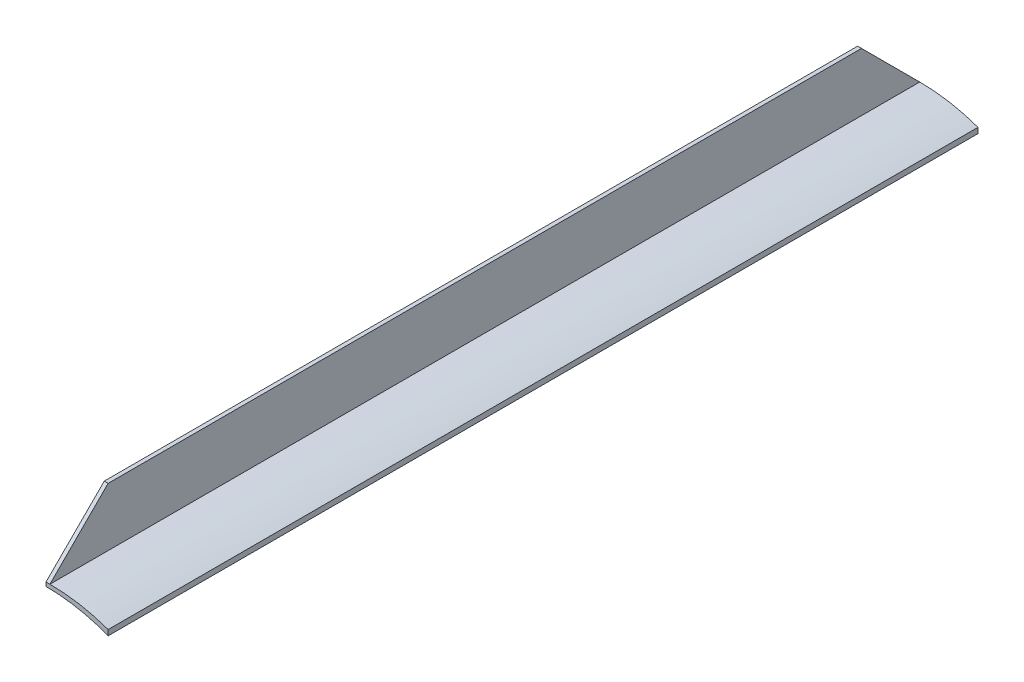
ISO-10303-21;
HEADER;
FILE_DESCRIPTION(('STEP AP214'),'2;1');
FILE_NAME('part.step','',(''),(''),'','','');
FILE_SCHEMA(('AUTOMOTIVE_DESIGN { 1 0 10303 214 1 1 1 1 }'));
ENDSEC;
DATA;
#1=APPLICATION_CONTEXT('core data for automotive mechanical design processes');
#2=APPLICATION_PROTOCOL_DEFINITION('international standard','automotive_design',2000,#1);
#3=PRODUCT_CONTEXT('',#1,'mechanical');
#4=PRODUCT('Part','Part','',(#3));
#5=PRODUCT_RELATED_PRODUCT_CATEGORY('part','',(#4));
#6=PRODUCT_DEFINITION_FORMATION('','',#4);
#7=PRODUCT_DEFINITION_CONTEXT('part definition',#1,'design');
#8=PRODUCT_DEFINITION('design','',#6,#7);
#9=PRODUCT_DEFINITION_SHAPE('','',#8);
#10=(LENGTH_UNIT() NAMED_UNIT(*) SI_UNIT(.MILLI.,.METRE.));
#11=(NAMED_UNIT(*) PLANE_ANGLE_UNIT() SI_UNIT($,.RADIAN.));
#12=(NAMED_UNIT(*) SI_UNIT($,.STERADIAN.) SOLID_ANGLE_UNIT());
#13=UNCERTAINTY_MEASURE_WITH_UNIT(LENGTH_MEASURE(1.E-05),#10,'distance_accuracy_value','');
#14=(GEOMETRIC_REPRESENTATION_CONTEXT(3) GLOBAL_UNCERTAINTY_ASSIGNED_CONTEXT((#13)) GLOBAL_UNIT_ASSIGNED_CONTEXT((#10,
#11,#12)) REPRESENTATION_CONTEXT('',''));
#15=CARTESIAN_POINT('',(0.,0.,0.));
#16=DIRECTION('',(0.,0.,1.));
#17=DIRECTION('',(1.,0.,0.));
#18=AXIS2_PLACEMENT_3D('',#15,#16,#17);
#19=CARTESIAN_POINT('',(1.5875,25.4,177.8));
#20=DIRECTION('',(-1.,0.,0.));
#21=DIRECTION('',(0.,-1.,0.));
#22=AXIS2_PLACEMENT_3D('',#19,#20,#21);
#23=PLANE('',#22);
#24=DIRECTION('',(0.,-0.707106781186548,-0.707106781186547));
#25=VECTOR('',#24,1.);
#26=CARTESIAN_POINT('',(1.5875,191.29375,11.9062499999998));
#27=LINE('',#26,#25);
#28=CARTESIAN_POINT('',(1.58750000000002,25.4,-153.9875));
#29=VERTEX_POINT('',#28);
#30=CARTESIAN_POINT('',(1.5875,1.5875,-177.8));
#31=VERTEX_POINT('',#30);
#32=EDGE_CURVE('E106',#29,#31,#27,.T.);
#33=ORIENTED_EDGE('',*,*,#32,.F.);
#34=DIRECTION('',(0.,0.,-1.));
#35=VECTOR('',#34,1.);
#36=CARTESIAN_POINT('',(1.5875,25.4,177.8));
#37=LINE('',#36,#35);
#38=CARTESIAN_POINT('',(1.58750000000002,25.4,153.9875));
#39=VERTEX_POINT('',#38);
#40=EDGE_CURVE('E131',#39,#29,#37,.T.);
#41=ORIENTED_EDGE('',*,*,#40,.F.);
#42=DIRECTION('',(0.,-0.707106781186548,0.707106781186547));
#43=VECTOR('',#42,1.);
#44=CARTESIAN_POINT('',(1.5875,13.49375,165.89375));
#45=LINE('',#44,#43);
#46=CARTESIAN_POINT('',(1.58750000000002,1.5875,177.8));
#47=VERTEX_POINT('',#46);
#48=EDGE_CURVE('E152',#39,#47,#45,.T.);
#49=ORIENTED_EDGE('',*,*,#48,.T.);
#50=DIRECTION('',(0.,0.,-1.));
#51=VECTOR('',#50,1.);
#52=CARTESIAN_POINT('',(1.5875,1.5875,177.8));
#53=LINE('',#52,#51);
#54=EDGE_CURVE('E134',#47,#31,#53,.T.);
#55=ORIENTED_EDGE('',*,*,#54,.T.);
#56=EDGE_LOOP('',(#33,#41,#49,#55));
#57=FACE_BOUND('',#56,.T.);
#58=ADVANCED_FACE('F35',(#57),#23,.F.);
#59=CARTESIAN_POINT('',(0.,25.4,177.8));
#60=DIRECTION('',(0.,-1.,0.));
#61=DIRECTION('',(0.,0.,-1.));
#62=AXIS2_PLACEMENT_3D('',#59,#60,#61);
#63=PLANE('',#62);
#64=DIRECTION('',(-1.,0.,0.));
#65=VECTOR('',#64,1.);
#66=CARTESIAN_POINT('',(387.35,25.4,-153.9875));
#67=LINE('',#66,#65);
#68=CARTESIAN_POINT('',(0.,25.4,-153.9875));
#69=VERTEX_POINT('',#68);
#70=EDGE_CURVE('E114',#29,#69,#67,.T.);
#71=ORIENTED_EDGE('',*,*,#70,.T.);
#72=DIRECTION('',(0.,0.,-1.));
#73=VECTOR('',#72,1.);
#74=CARTESIAN_POINT('',(0.,25.4,177.8));
#75=LINE('',#74,#73);
#76=CARTESIAN_POINT('',(0.,25.4,153.9875));
#77=VERTEX_POINT('',#76);
#78=EDGE_CURVE('E113',#77,#69,#75,.T.);
#79=ORIENTED_EDGE('',*,*,#78,.F.);
#80=DIRECTION('',(-1.,0.,0.));
#81=VECTOR('',#80,1.);
#82=CARTESIAN_POINT('',(387.35,25.4,153.9875));
#83=LINE('',#82,#81);
#84=EDGE_CURVE('E160',#39,#77,#83,.T.);
#85=ORIENTED_EDGE('',*,*,#84,.F.);
#86=ORIENTED_EDGE('',*,*,#40,.T.);
#87=EDGE_LOOP('',(#71,#79,#85,#86));
#88=FACE_BOUND('',#87,.T.);
#89=ADVANCED_FACE('F172',(#88),#63,.F.);
#90=CARTESIAN_POINT('',(0.,0.,177.8));
#91=DIRECTION('',(1.,0.,0.));
#92=DIRECTION('',(0.,0.,-1.));
#93=AXIS2_PLACEMENT_3D('',#90,#91,#92);
#94=PLANE('',#93);
#95=DIRECTION('',(0.,-0.707106781186548,-0.707106781186547));
#96=VECTOR('',#95,1.);
#97=CARTESIAN_POINT('',(0.,25.4,-153.9875));
#98=LINE('',#97,#96);
#99=CARTESIAN_POINT('',(0.,1.5875,-177.8));
#100=VERTEX_POINT('',#99);
#101=EDGE_CURVE('E103',#69,#100,#98,.T.);
#102=ORIENTED_EDGE('',*,*,#101,.T.);
#103=DIRECTION('',(0.,-1.,0.));
#104=VECTOR('',#103,1.);
#105=CARTESIAN_POINT('',(0.,0.,-177.8));
#106=LINE('',#105,#104);
#107=CARTESIAN_POINT('',(0.,0.,-177.8));
#108=VERTEX_POINT('',#107);
#109=EDGE_CURVE('E79',#100,#108,#106,.T.);
#110=ORIENTED_EDGE('',*,*,#109,.T.);
#111=DIRECTION('',(0.,0.,-1.));
#112=VECTOR('',#111,1.);
#113=CARTESIAN_POINT('',(0.,0.,177.8));
#114=LINE('',#113,#112);
#115=CARTESIAN_POINT('',(0.,0.,177.8));
#116=VERTEX_POINT('',#115);
#117=EDGE_CURVE('E128',#116,#108,#114,.T.);
#118=ORIENTED_EDGE('',*,*,#117,.F.);
#119=DIRECTION('',(0.,-1.,0.));
#120=VECTOR('',#119,1.);
#121=CARTESIAN_POINT('',(0.,0.,177.8));
#122=LINE('',#121,#120);
#123=CARTESIAN_POINT('',(0.,1.58750000000001,177.8));
#124=VERTEX_POINT('',#123);
#125=EDGE_CURVE('E58',#124,#116,#122,.T.);
#126=ORIENTED_EDGE('',*,*,#125,.F.);
#127=DIRECTION('',(0.,-0.707106781186548,0.707106781186547));
#128=VECTOR('',#127,1.);
#129=CARTESIAN_POINT('',(0.,25.4,153.9875));
#130=LINE('',#129,#128);
#131=EDGE_CURVE('E50',#77,#124,#130,.T.);
#132=ORIENTED_EDGE('',*,*,#131,.F.);
#133=ORIENTED_EDGE('',*,*,#78,.T.);
#134=EDGE_LOOP('',(#102,#110,#118,#126,#132,#133));
#135=FACE_BOUND('',#134,.T.);
#136=ADVANCED_FACE('F111',(#135),#94,.F.);
#137=CARTESIAN_POINT('',(0.,-69.85,-177.8));
#138=DIRECTION('',(0.,0.,-1.));
#139=DIRECTION('',(-1.,0.,0.));
#140=AXIS2_PLACEMENT_3D('',#137,#138,#139);
#141=PLANE('',#140);
#142=ORIENTED_EDGE('',*,*,#109,.F.);
#143=DIRECTION('',(1.,0.,0.));
#144=VECTOR('',#143,1.);
#145=CARTESIAN_POINT('',(0.,1.58750000000001,-177.8));
#146=LINE('',#145,#144);
#147=EDGE_CURVE('E11',#100,#31,#146,.T.);
#148=ORIENTED_EDGE('',*,*,#147,.T.);
#149=CARTESIAN_POINT('',(1.5875,-69.05625,-177.8));
#150=DIRECTION('',(0.,0.,1.));
#151=DIRECTION('',(-1.,0.,0.));
#152=AXIS2_PLACEMENT_3D('',#149,#150,#151);
#153=CIRCLE('',#152,70.64375);
#154=CARTESIAN_POINT('',(25.4,-2.54682015871735,-177.8));
#155=VERTEX_POINT('',#154);
#156=EDGE_CURVE('E121',#155,#31,#153,.T.);
#157=ORIENTED_EDGE('',*,*,#156,.F.);
#158=DIRECTION('',(0.,1.,0.));
#159=VECTOR('',#158,1.);
#160=CARTESIAN_POINT('',(25.4,-2.54682015871734,-177.8));
#161=LINE('',#160,#159);
#162=CARTESIAN_POINT('',(25.4,-4.78186263615656,-177.8));
#163=VERTEX_POINT('',#162);
#164=EDGE_CURVE('E124',#163,#155,#161,.T.);
#165=ORIENTED_EDGE('',*,*,#164,.F.);
#166=CARTESIAN_POINT('',(0.,-69.85,-177.8));
#167=DIRECTION('',(0.,0.,-1.));
#168=DIRECTION('',(-1.,0.,0.));
#169=AXIS2_PLACEMENT_3D('',#166,#167,#168);
#170=CIRCLE('',#169,69.85);
#171=EDGE_CURVE('E119',#108,#163,#170,.T.);
#172=ORIENTED_EDGE('',*,*,#171,.F.);
#173=EDGE_LOOP('',(#142,#148,#157,#165,#172));
#174=FACE_BOUND('',#173,.T.);
#175=ADVANCED_FACE('F117',(#174),#141,.T.);
#176=CARTESIAN_POINT('',(0.,-69.85,177.8));
#177=DIRECTION('',(0.,0.,-1.));
#178=DIRECTION('',(-1.,0.,0.));
#179=AXIS2_PLACEMENT_3D('',#176,#177,#178);
#180=CYLINDRICAL_SURFACE('',#179,69.85);
#181=ORIENTED_EDGE('',*,*,#171,.T.);
#182=DIRECTION('',(0.,0.,-1.));
#183=VECTOR('',#182,1.);
#184=CARTESIAN_POINT('',(25.4,-4.78186263615656,177.8));
#185=LINE('',#184,#183);
#186=CARTESIAN_POINT('',(25.4,-4.78186263615656,177.8));
#187=VERTEX_POINT('',#186);
#188=EDGE_CURVE('E140',#187,#163,#185,.T.);
#189=ORIENTED_EDGE('',*,*,#188,.F.);
#190=CARTESIAN_POINT('',(0.,-69.85,177.8));
#191=DIRECTION('',(0.,0.,-1.));
#192=DIRECTION('',(-1.,0.,0.));
#193=AXIS2_PLACEMENT_3D('',#190,#191,#192);
#194=CIRCLE('',#193,69.85);
#195=EDGE_CURVE('E120',#116,#187,#194,.T.);
#196=ORIENTED_EDGE('',*,*,#195,.F.);
#197=ORIENTED_EDGE('',*,*,#117,.T.);
#198=EDGE_LOOP('',(#181,#189,#196,#197));
#199=FACE_BOUND('',#198,.T.);
#200=ADVANCED_FACE('F37',(#199),#180,.F.);
#201=CARTESIAN_POINT('',(25.4,-2.54682015871734,177.8));
#202=DIRECTION('',(-1.,0.,0.));
#203=DIRECTION('',(0.,-1.,0.));
#204=AXIS2_PLACEMENT_3D('',#201,#202,#203);
#205=PLANE('',#204);
#206=ORIENTED_EDGE('',*,*,#164,.T.);
#207=DIRECTION('',(0.,0.,-1.));
#208=VECTOR('',#207,1.);
#209=CARTESIAN_POINT('',(25.4,-2.54682015871735,177.8));
#210=LINE('',#209,#208);
#211=CARTESIAN_POINT('',(25.4,-2.54682015871735,177.8));
#212=VERTEX_POINT('',#211);
#213=EDGE_CURVE('E137',#212,#155,#210,.T.);
#214=ORIENTED_EDGE('',*,*,#213,.F.);
#215=DIRECTION('',(0.,1.,0.));
#216=VECTOR('',#215,1.);
#217=CARTESIAN_POINT('',(25.4,-2.54682015871734,177.8));
#218=LINE('',#217,#216);
#219=EDGE_CURVE('E85',#187,#212,#218,.T.);
#220=ORIENTED_EDGE('',*,*,#219,.F.);
#221=ORIENTED_EDGE('',*,*,#188,.T.);
#222=EDGE_LOOP('',(#206,#214,#220,#221));
#223=FACE_BOUND('',#222,.T.);
#224=ADVANCED_FACE('F153',(#223),#205,.F.);
#225=CARTESIAN_POINT('',(1.5875,-69.05625,177.8));
#226=DIRECTION('',(0.,0.,-1.));
#227=DIRECTION('',(-1.,0.,0.));
#228=AXIS2_PLACEMENT_3D('',#225,#226,#227);
#229=CYLINDRICAL_SURFACE('',#228,70.64375);
#230=ORIENTED_EDGE('',*,*,#156,.T.);
#231=ORIENTED_EDGE('',*,*,#54,.F.);
#232=CARTESIAN_POINT('',(1.5875,-69.05625,177.8));
#233=DIRECTION('',(0.,0.,1.));
#234=DIRECTION('',(-1.,0.,0.));
#235=AXIS2_PLACEMENT_3D('',#232,#233,#234);
#236=CIRCLE('',#235,70.64375);
#237=EDGE_CURVE('E144',#212,#47,#236,.T.);
#238=ORIENTED_EDGE('',*,*,#237,.F.);
#239=ORIENTED_EDGE('',*,*,#213,.T.);
#240=EDGE_LOOP('',(#230,#231,#238,#239));
#241=FACE_BOUND('',#240,.T.);
#242=ADVANCED_FACE('F156',(#241),#229,.T.);
#243=CARTESIAN_POINT('',(0.,-69.85,177.8));
#244=DIRECTION('',(0.,0.,-1.));
#245=DIRECTION('',(-1.,0.,0.));
#246=AXIS2_PLACEMENT_3D('',#243,#244,#245);
#247=PLANE('',#246);
#248=ORIENTED_EDGE('',*,*,#237,.T.);
#249=DIRECTION('',(-1.,0.,0.));
#250=VECTOR('',#249,1.);
#251=CARTESIAN_POINT('',(0.,1.58750000000001,177.8));
#252=LINE('',#251,#250);
#253=EDGE_CURVE('E43',#47,#124,#252,.T.);
#254=ORIENTED_EDGE('',*,*,#253,.T.);
#255=ORIENTED_EDGE('',*,*,#125,.T.);
#256=ORIENTED_EDGE('',*,*,#195,.T.);
#257=ORIENTED_EDGE('',*,*,#219,.T.);
#258=EDGE_LOOP('',(#248,#254,#255,#256,#257));
#259=FACE_BOUND('',#258,.T.);
#260=ADVANCED_FACE('F142',(#259),#247,.F.);
#261=CARTESIAN_POINT('',(387.35,25.4,153.9875));
#262=DIRECTION('',(0.,-0.707106781186547,-0.707106781186548));
#263=DIRECTION('',(0.,0.707106781186548,-0.707106781186547));
#264=AXIS2_PLACEMENT_3D('',#261,#262,#263);
#265=PLANE('',#264);
#266=ORIENTED_EDGE('',*,*,#84,.T.);
#267=ORIENTED_EDGE('',*,*,#131,.T.);
#268=ORIENTED_EDGE('',*,*,#253,.F.);
#269=ORIENTED_EDGE('',*,*,#48,.F.);
#270=EDGE_LOOP('',(#266,#267,#268,#269));
#271=FACE_BOUND('',#270,.T.);
#272=ADVANCED_FACE('F185',(#271),#265,.F.);
#273=CARTESIAN_POINT('',(387.35,25.4,-153.9875));
#274=DIRECTION('',(0.,0.707106781186547,-0.707106781186548));
#275=DIRECTION('',(0.,0.707106781186548,0.707106781186547));
#276=AXIS2_PLACEMENT_3D('',#273,#274,#275);
#277=PLANE('',#276);
#278=ORIENTED_EDGE('',*,*,#32,.T.);
#279=ORIENTED_EDGE('',*,*,#147,.F.);
#280=ORIENTED_EDGE('',*,*,#101,.F.);
#281=ORIENTED_EDGE('',*,*,#70,.F.);
#282=EDGE_LOOP('',(#278,#279,#280,#281));
#283=FACE_BOUND('',#282,.T.);
#284=ADVANCED_FACE('F102',(#283),#277,.T.);
#285=CLOSED_SHELL('',(#58,#89,#136,#175,#200,#224,#242,#260,#272,#284));
#286=MANIFOLD_SOLID_BREP('B2',#285);
#287=ADVANCED_BREP_SHAPE_REPRESENTATION('',(#18,#286),#14);
#288=SHAPE_DEFINITION_REPRESENTATION(#9,#287);
ENDSEC;
END-ISO-10303-21;
